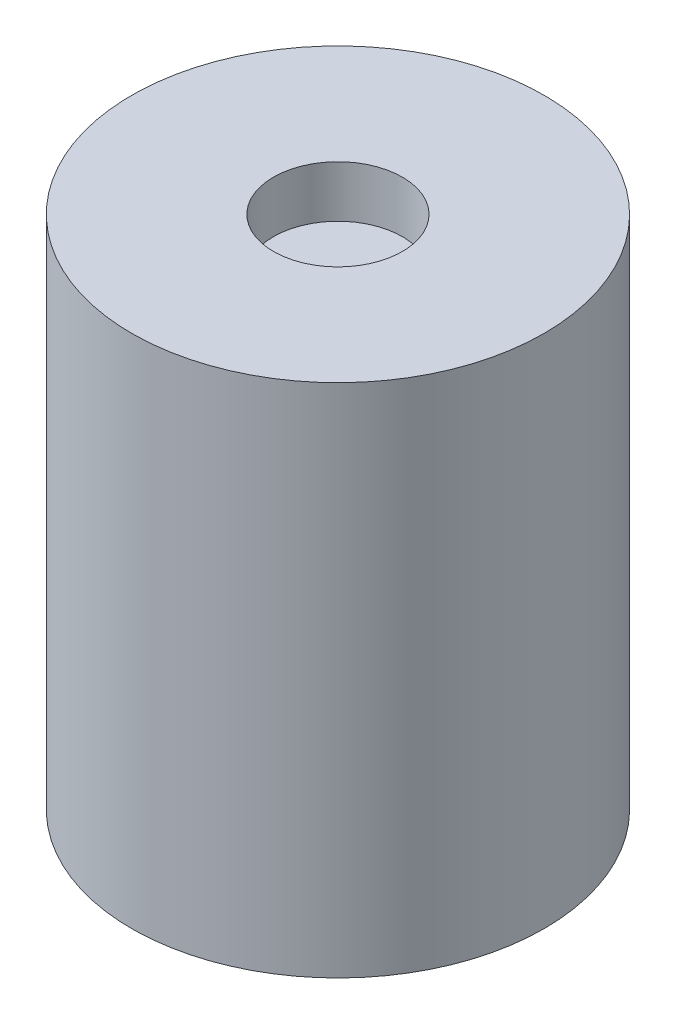
ISO-10303-21;
HEADER;
FILE_DESCRIPTION(('STEP AP214'),'2;1');
FILE_NAME('part.step','',(''),(''),'','','');
FILE_SCHEMA(('AUTOMOTIVE_DESIGN { 1 0 10303 214 1 1 1 1 }'));
ENDSEC;
DATA;
#1=APPLICATION_CONTEXT('core data for automotive mechanical design processes');
#2=APPLICATION_PROTOCOL_DEFINITION('international standard','automotive_design',2000,#1);
#3=PRODUCT_CONTEXT('',#1,'mechanical');
#4=PRODUCT('Part','Part','',(#3));
#5=PRODUCT_RELATED_PRODUCT_CATEGORY('part','',(#4));
#6=PRODUCT_DEFINITION_FORMATION('','',#4);
#7=PRODUCT_DEFINITION_CONTEXT('part definition',#1,'design');
#8=PRODUCT_DEFINITION('design','',#6,#7);
#9=PRODUCT_DEFINITION_SHAPE('','',#8);
#10=(LENGTH_UNIT() NAMED_UNIT(*) SI_UNIT(.MILLI.,.METRE.));
#11=(NAMED_UNIT(*) PLANE_ANGLE_UNIT() SI_UNIT($,.RADIAN.));
#12=(NAMED_UNIT(*) SI_UNIT($,.STERADIAN.) SOLID_ANGLE_UNIT());
#13=UNCERTAINTY_MEASURE_WITH_UNIT(LENGTH_MEASURE(1.E-05),#10,'distance_accuracy_value','');
#14=(GEOMETRIC_REPRESENTATION_CONTEXT(3) GLOBAL_UNCERTAINTY_ASSIGNED_CONTEXT((#13)) GLOBAL_UNIT_ASSIGNED_CONTEXT((#10,
#11,#12)) REPRESENTATION_CONTEXT('',''));
#15=CARTESIAN_POINT('',(0.,0.,0.));
#16=DIRECTION('',(0.,0.,1.));
#17=DIRECTION('',(1.,0.,0.));
#18=AXIS2_PLACEMENT_3D('',#15,#16,#17);
#19=CARTESIAN_POINT('',(0.,0.,0.));
#20=DIRECTION('',(0.,1.,0.));
#21=DIRECTION('',(1.,0.,0.));
#22=AXIS2_PLACEMENT_3D('',#19,#20,#21);
#23=PLANE('',#22);
#24=CARTESIAN_POINT('',(13.4187290871268,0.,8.71422456024041));
#25=DIRECTION('',(0.,1.,0.));
#26=DIRECTION('',(1.,0.,0.));
#27=AXIS2_PLACEMENT_3D('',#24,#25,#26);
#28=CIRCLE('',#27,2.);
#29=CARTESIAN_POINT('',(11.4187290871268,0.,8.71422456024041));
#30=VERTEX_POINT('',#29);
#31=EDGE_CURVE('E129',#30,#30,#28,.T.);
#32=ORIENTED_EDGE('',*,*,#31,.T.);
#33=EDGE_LOOP('',(#32));
#34=FACE_BOUND('',#33,.T.);
#35=CARTESIAN_POINT('',(-8.,0.,-13.856406460551));
#36=DIRECTION('',(0.,1.,0.));
#37=DIRECTION('',(1.,0.,0.));
#38=AXIS2_PLACEMENT_3D('',#35,#36,#37);
#39=CIRCLE('',#38,2.);
#40=CARTESIAN_POINT('',(-10.,0.,-13.856406460551));
#41=VERTEX_POINT('',#40);
#42=EDGE_CURVE('E144',#41,#41,#39,.T.);
#43=ORIENTED_EDGE('',*,*,#42,.T.);
#44=EDGE_LOOP('',(#43));
#45=FACE_BOUND('',#44,.T.);
#46=CARTESIAN_POINT('',(-16.,0.,0.));
#47=DIRECTION('',(0.,1.,0.));
#48=DIRECTION('',(1.,0.,0.));
#49=AXIS2_PLACEMENT_3D('',#46,#47,#48);
#50=CIRCLE('',#49,2.);
#51=CARTESIAN_POINT('',(-18.,0.,0.));
#52=VERTEX_POINT('',#51);
#53=EDGE_CURVE('E140',#52,#52,#50,.T.);
#54=ORIENTED_EDGE('',*,*,#53,.T.);
#55=EDGE_LOOP('',(#54));
#56=FACE_BOUND('',#55,.T.);
#57=CARTESIAN_POINT('',(16.,0.,0.));
#58=DIRECTION('',(0.,1.,0.));
#59=DIRECTION('',(1.,0.,0.));
#60=AXIS2_PLACEMENT_3D('',#57,#58,#59);
#61=CIRCLE('',#60,2.);
#62=CARTESIAN_POINT('',(14.,0.,0.));
#63=VERTEX_POINT('',#62);
#64=EDGE_CURVE('E21',#63,#63,#61,.T.);
#65=ORIENTED_EDGE('',*,*,#64,.T.);
#66=EDGE_LOOP('',(#65));
#67=FACE_BOUND('',#66,.T.);
#68=CARTESIAN_POINT('',(8.,0.,-13.856406460551));
#69=DIRECTION('',(0.,1.,0.));
#70=DIRECTION('',(1.,0.,0.));
#71=AXIS2_PLACEMENT_3D('',#68,#69,#70);
#72=CIRCLE('',#71,2.);
#73=CARTESIAN_POINT('',(6.,0.,-13.856406460551));
#74=VERTEX_POINT('',#73);
#75=EDGE_CURVE('E124',#74,#74,#72,.T.);
#76=ORIENTED_EDGE('',*,*,#75,.T.);
#77=EDGE_LOOP('',(#76));
#78=FACE_BOUND('',#77,.T.);
#79=CARTESIAN_POINT('',(-13.4187290871267,0.,8.71422456024041));
#80=DIRECTION('',(0.,1.,0.));
#81=DIRECTION('',(1.,0.,0.));
#82=AXIS2_PLACEMENT_3D('',#79,#80,#81);
#83=CIRCLE('',#82,2.);
#84=CARTESIAN_POINT('',(-15.4187290871267,0.,8.71422456024041));
#85=VERTEX_POINT('',#84);
#86=EDGE_CURVE('E165',#85,#85,#83,.T.);
#87=ORIENTED_EDGE('',*,*,#86,.T.);
#88=EDGE_LOOP('',(#87));
#89=FACE_BOUND('',#88,.T.);
#90=CARTESIAN_POINT('',(0.,0.,0.));
#91=DIRECTION('',(0.,1.,0.));
#92=DIRECTION('',(-1.,0.,0.));
#93=AXIS2_PLACEMENT_3D('',#90,#91,#92);
#94=CIRCLE('',#93,20.);
#95=CARTESIAN_POINT('',(20.,0.,0.));
#96=VERTEX_POINT('',#95);
#97=EDGE_CURVE('E11',#96,#96,#94,.T.);
#98=ORIENTED_EDGE('',*,*,#97,.F.);
#99=EDGE_LOOP('',(#98));
#100=FACE_BOUND('',#99,.T.);
#101=ADVANCED_FACE('F17',(#34,#45,#56,#67,#78,#89,#100),#23,.F.);
#102=CARTESIAN_POINT('',(0.,50.,0.));
#103=DIRECTION('',(0.,1.,0.));
#104=DIRECTION('',(1.,0.,0.));
#105=AXIS2_PLACEMENT_3D('',#102,#103,#104);
#106=PLANE('',#105);
#107=CARTESIAN_POINT('',(0.,50.,0.));
#108=DIRECTION('',(0.,-1.,0.));
#109=DIRECTION('',(1.,0.,0.));
#110=AXIS2_PLACEMENT_3D('',#107,#108,#109);
#111=CIRCLE('',#110,6.25);
#112=CARTESIAN_POINT('',(-6.25,50.,0.));
#113=VERTEX_POINT('',#112);
#114=EDGE_CURVE('E131',#113,#113,#111,.T.);
#115=ORIENTED_EDGE('',*,*,#114,.T.);
#116=EDGE_LOOP('',(#115));
#117=FACE_BOUND('',#116,.T.);
#118=CARTESIAN_POINT('',(0.,50.,0.));
#119=DIRECTION('',(0.,1.,0.));
#120=DIRECTION('',(-1.,0.,0.));
#121=AXIS2_PLACEMENT_3D('',#118,#119,#120);
#122=CIRCLE('',#121,20.);
#123=CARTESIAN_POINT('',(20.,50.,0.));
#124=VERTEX_POINT('',#123);
#125=EDGE_CURVE('E149',#124,#124,#122,.T.);
#126=ORIENTED_EDGE('',*,*,#125,.T.);
#127=EDGE_LOOP('',(#126));
#128=FACE_BOUND('',#127,.T.);
#129=ADVANCED_FACE('F197',(#117,#128),#106,.T.);
#130=CARTESIAN_POINT('',(0.,0.,0.));
#131=DIRECTION('',(0.,1.,0.));
#132=DIRECTION('',(-1.,0.,0.));
#133=AXIS2_PLACEMENT_3D('',#130,#131,#132);
#134=CYLINDRICAL_SURFACE('',#133,20.);
#135=ORIENTED_EDGE('',*,*,#125,.F.);
#136=DIRECTION('',(0.,-1.,0.));
#137=VECTOR('',#136,1.);
#138=CARTESIAN_POINT('',(20.,0.,0.));
#139=LINE('',#138,#137);
#140=EDGE_CURVE('E28',#124,#96,#139,.T.);
#141=ORIENTED_EDGE('',*,*,#140,.T.);
#142=ORIENTED_EDGE('',*,*,#97,.T.);
#143=ORIENTED_EDGE('',*,*,#140,.F.);
#144=EDGE_LOOP('',(#135,#141,#142,#143));
#145=FACE_BOUND('',#144,.T.);
#146=ADVANCED_FACE('F200',(#145),#134,.T.);
#147=CARTESIAN_POINT('',(13.4187290871268,6.,8.71422456024041));
#148=DIRECTION('',(0.,-1.,0.));
#149=DIRECTION('',(0.,0.,-1.));
#150=AXIS2_PLACEMENT_3D('',#147,#148,#149);
#151=PLANE('',#150);
#152=CARTESIAN_POINT('',(13.4187290871268,6.,8.71422456024041));
#153=DIRECTION('',(0.,1.,0.));
#154=DIRECTION('',(1.,0.,0.));
#155=AXIS2_PLACEMENT_3D('',#152,#153,#154);
#156=CIRCLE('',#155,2.);
#157=CARTESIAN_POINT('',(11.4187290871268,6.,8.71422456024041));
#158=VERTEX_POINT('',#157);
#159=EDGE_CURVE('E148',#158,#158,#156,.T.);
#160=ORIENTED_EDGE('',*,*,#159,.F.);
#161=EDGE_LOOP('',(#160));
#162=FACE_BOUND('',#161,.T.);
#163=ADVANCED_FACE('F204',(#162),#151,.T.);
#164=CARTESIAN_POINT('',(13.4187290871268,0.,8.71422456024041));
#165=DIRECTION('',(0.,1.,0.));
#166=DIRECTION('',(1.,0.,0.));
#167=AXIS2_PLACEMENT_3D('',#164,#165,#166);
#168=CYLINDRICAL_SURFACE('',#167,2.);
#169=ORIENTED_EDGE('',*,*,#31,.F.);
#170=DIRECTION('',(0.,1.,0.));
#171=VECTOR('',#170,1.);
#172=CARTESIAN_POINT('',(11.4187290871268,0.,8.71422456024041));
#173=LINE('',#172,#171);
#174=EDGE_CURVE('E90',#30,#158,#173,.T.);
#175=ORIENTED_EDGE('',*,*,#174,.T.);
#176=ORIENTED_EDGE('',*,*,#159,.T.);
#177=ORIENTED_EDGE('',*,*,#174,.F.);
#178=EDGE_LOOP('',(#169,#175,#176,#177));
#179=FACE_BOUND('',#178,.T.);
#180=ADVANCED_FACE('F211',(#179),#168,.F.);
#181=CARTESIAN_POINT('',(-8.,6.,-13.856406460551));
#182=DIRECTION('',(0.,-1.,0.));
#183=DIRECTION('',(0.,0.,-1.));
#184=AXIS2_PLACEMENT_3D('',#181,#182,#183);
#185=PLANE('',#184);
#186=CARTESIAN_POINT('',(-8.,6.,-13.856406460551));
#187=DIRECTION('',(0.,1.,0.));
#188=DIRECTION('',(1.,0.,0.));
#189=AXIS2_PLACEMENT_3D('',#186,#187,#188);
#190=CIRCLE('',#189,2.);
#191=CARTESIAN_POINT('',(-10.,6.,-13.856406460551));
#192=VERTEX_POINT('',#191);
#193=EDGE_CURVE('E82',#192,#192,#190,.T.);
#194=ORIENTED_EDGE('',*,*,#193,.F.);
#195=EDGE_LOOP('',(#194));
#196=FACE_BOUND('',#195,.T.);
#197=ADVANCED_FACE('F237',(#196),#185,.T.);
#198=CARTESIAN_POINT('',(-8.,0.,-13.856406460551));
#199=DIRECTION('',(0.,1.,0.));
#200=DIRECTION('',(1.,0.,0.));
#201=AXIS2_PLACEMENT_3D('',#198,#199,#200);
#202=CYLINDRICAL_SURFACE('',#201,2.);
#203=ORIENTED_EDGE('',*,*,#42,.F.);
#204=DIRECTION('',(0.,1.,0.));
#205=VECTOR('',#204,1.);
#206=CARTESIAN_POINT('',(-10.,0.,-13.856406460551));
#207=LINE('',#206,#205);
#208=EDGE_CURVE('E130',#41,#192,#207,.T.);
#209=ORIENTED_EDGE('',*,*,#208,.T.);
#210=ORIENTED_EDGE('',*,*,#193,.T.);
#211=ORIENTED_EDGE('',*,*,#208,.F.);
#212=EDGE_LOOP('',(#203,#209,#210,#211));
#213=FACE_BOUND('',#212,.T.);
#214=ADVANCED_FACE('F242',(#213),#202,.F.);
#215=CARTESIAN_POINT('',(-16.,6.,0.));
#216=DIRECTION('',(0.,-1.,0.));
#217=DIRECTION('',(0.,0.,-1.));
#218=AXIS2_PLACEMENT_3D('',#215,#216,#217);
#219=PLANE('',#218);
#220=CARTESIAN_POINT('',(-16.,6.,0.));
#221=DIRECTION('',(0.,1.,0.));
#222=DIRECTION('',(1.,0.,0.));
#223=AXIS2_PLACEMENT_3D('',#220,#221,#222);
#224=CIRCLE('',#223,2.);
#225=CARTESIAN_POINT('',(-18.,6.,0.));
#226=VERTEX_POINT('',#225);
#227=EDGE_CURVE('E141',#226,#226,#224,.T.);
#228=ORIENTED_EDGE('',*,*,#227,.F.);
#229=EDGE_LOOP('',(#228));
#230=FACE_BOUND('',#229,.T.);
#231=ADVANCED_FACE('F249',(#230),#219,.T.);
#232=CARTESIAN_POINT('',(-16.,0.,0.));
#233=DIRECTION('',(0.,1.,0.));
#234=DIRECTION('',(1.,0.,0.));
#235=AXIS2_PLACEMENT_3D('',#232,#233,#234);
#236=CYLINDRICAL_SURFACE('',#235,2.);
#237=ORIENTED_EDGE('',*,*,#53,.F.);
#238=DIRECTION('',(0.,1.,0.));
#239=VECTOR('',#238,1.);
#240=CARTESIAN_POINT('',(-18.,0.,0.));
#241=LINE('',#240,#239);
#242=EDGE_CURVE('E145',#52,#226,#241,.T.);
#243=ORIENTED_EDGE('',*,*,#242,.T.);
#244=ORIENTED_EDGE('',*,*,#227,.T.);
#245=ORIENTED_EDGE('',*,*,#242,.F.);
#246=EDGE_LOOP('',(#237,#243,#244,#245));
#247=FACE_BOUND('',#246,.T.);
#248=ADVANCED_FACE('F259',(#247),#236,.F.);
#249=CARTESIAN_POINT('',(16.,6.,0.));
#250=DIRECTION('',(0.,-1.,0.));
#251=DIRECTION('',(0.,0.,-1.));
#252=AXIS2_PLACEMENT_3D('',#249,#250,#251);
#253=PLANE('',#252);
#254=CARTESIAN_POINT('',(16.,6.,0.));
#255=DIRECTION('',(0.,1.,0.));
#256=DIRECTION('',(1.,0.,0.));
#257=AXIS2_PLACEMENT_3D('',#254,#255,#256);
#258=CIRCLE('',#257,2.);
#259=CARTESIAN_POINT('',(14.,6.,0.));
#260=VERTEX_POINT('',#259);
#261=EDGE_CURVE('E136',#260,#260,#258,.T.);
#262=ORIENTED_EDGE('',*,*,#261,.F.);
#263=EDGE_LOOP('',(#262));
#264=FACE_BOUND('',#263,.T.);
#265=ADVANCED_FACE('F223',(#264),#253,.T.);
#266=CARTESIAN_POINT('',(16.,0.,0.));
#267=DIRECTION('',(0.,1.,0.));
#268=DIRECTION('',(1.,0.,0.));
#269=AXIS2_PLACEMENT_3D('',#266,#267,#268);
#270=CYLINDRICAL_SURFACE('',#269,2.);
#271=ORIENTED_EDGE('',*,*,#64,.F.);
#272=DIRECTION('',(0.,1.,0.));
#273=VECTOR('',#272,1.);
#274=CARTESIAN_POINT('',(14.,0.,0.));
#275=LINE('',#274,#273);
#276=EDGE_CURVE('E123',#63,#260,#275,.T.);
#277=ORIENTED_EDGE('',*,*,#276,.T.);
#278=ORIENTED_EDGE('',*,*,#261,.T.);
#279=ORIENTED_EDGE('',*,*,#276,.F.);
#280=EDGE_LOOP('',(#271,#277,#278,#279));
#281=FACE_BOUND('',#280,.T.);
#282=ADVANCED_FACE('F229',(#281),#270,.F.);
#283=CARTESIAN_POINT('',(8.,6.,-13.856406460551));
#284=DIRECTION('',(0.,-1.,0.));
#285=DIRECTION('',(0.,0.,-1.));
#286=AXIS2_PLACEMENT_3D('',#283,#284,#285);
#287=PLANE('',#286);
#288=CARTESIAN_POINT('',(8.,6.,-13.856406460551));
#289=DIRECTION('',(0.,1.,0.));
#290=DIRECTION('',(1.,0.,0.));
#291=AXIS2_PLACEMENT_3D('',#288,#289,#290);
#292=CIRCLE('',#291,2.);
#293=CARTESIAN_POINT('',(6.,6.,-13.856406460551));
#294=VERTEX_POINT('',#293);
#295=EDGE_CURVE('E109',#294,#294,#292,.T.);
#296=ORIENTED_EDGE('',*,*,#295,.F.);
#297=EDGE_LOOP('',(#296));
#298=FACE_BOUND('',#297,.T.);
#299=ADVANCED_FACE('F228',(#298),#287,.T.);
#300=CARTESIAN_POINT('',(8.,0.,-13.856406460551));
#301=DIRECTION('',(0.,1.,0.));
#302=DIRECTION('',(1.,0.,0.));
#303=AXIS2_PLACEMENT_3D('',#300,#301,#302);
#304=CYLINDRICAL_SURFACE('',#303,2.);
#305=ORIENTED_EDGE('',*,*,#75,.F.);
#306=DIRECTION('',(0.,1.,0.));
#307=VECTOR('',#306,1.);
#308=CARTESIAN_POINT('',(6.,0.,-13.856406460551));
#309=LINE('',#308,#307);
#310=EDGE_CURVE('E112',#74,#294,#309,.T.);
#311=ORIENTED_EDGE('',*,*,#310,.T.);
#312=ORIENTED_EDGE('',*,*,#295,.T.);
#313=ORIENTED_EDGE('',*,*,#310,.F.);
#314=EDGE_LOOP('',(#305,#311,#312,#313));
#315=FACE_BOUND('',#314,.T.);
#316=ADVANCED_FACE('F111',(#315),#304,.F.);
#317=CARTESIAN_POINT('',(-13.4187290871267,6.,8.71422456024041));
#318=DIRECTION('',(0.,-1.,0.));
#319=DIRECTION('',(0.,0.,-1.));
#320=AXIS2_PLACEMENT_3D('',#317,#318,#319);
#321=PLANE('',#320);
#322=CARTESIAN_POINT('',(-13.4187290871267,6.,8.71422456024041));
#323=DIRECTION('',(0.,1.,0.));
#324=DIRECTION('',(1.,0.,0.));
#325=AXIS2_PLACEMENT_3D('',#322,#323,#324);
#326=CIRCLE('',#325,2.);
#327=CARTESIAN_POINT('',(-15.4187290871267,6.,8.71422456024041));
#328=VERTEX_POINT('',#327);
#329=EDGE_CURVE('E164',#328,#328,#326,.T.);
#330=ORIENTED_EDGE('',*,*,#329,.F.);
#331=EDGE_LOOP('',(#330));
#332=FACE_BOUND('',#331,.T.);
#333=ADVANCED_FACE('F227',(#332),#321,.T.);
#334=CARTESIAN_POINT('',(-13.4187290871267,0.,8.71422456024041));
#335=DIRECTION('',(0.,1.,0.));
#336=DIRECTION('',(1.,0.,0.));
#337=AXIS2_PLACEMENT_3D('',#334,#335,#336);
#338=CYLINDRICAL_SURFACE('',#337,2.);
#339=ORIENTED_EDGE('',*,*,#86,.F.);
#340=DIRECTION('',(0.,1.,0.));
#341=VECTOR('',#340,1.);
#342=CARTESIAN_POINT('',(-15.4187290871267,0.,8.71422456024041));
#343=LINE('',#342,#341);
#344=EDGE_CURVE('E160',#85,#328,#343,.T.);
#345=ORIENTED_EDGE('',*,*,#344,.T.);
#346=ORIENTED_EDGE('',*,*,#329,.T.);
#347=ORIENTED_EDGE('',*,*,#344,.F.);
#348=EDGE_LOOP('',(#339,#345,#346,#347));
#349=FACE_BOUND('',#348,.T.);
#350=ADVANCED_FACE('F234',(#349),#338,.F.);
#351=CARTESIAN_POINT('',(0.,45.,0.));
#352=DIRECTION('',(0.,1.,0.));
#353=DIRECTION('',(1.,0.,0.));
#354=AXIS2_PLACEMENT_3D('',#351,#352,#353);
#355=PLANE('',#354);
#356=CARTESIAN_POINT('',(0.,45.,0.));
#357=DIRECTION('',(0.,-1.,0.));
#358=DIRECTION('',(1.,0.,0.));
#359=AXIS2_PLACEMENT_3D('',#356,#357,#358);
#360=CIRCLE('',#359,6.25);
#361=CARTESIAN_POINT('',(-6.25,45.,0.));
#362=VERTEX_POINT('',#361);
#363=EDGE_CURVE('E169',#362,#362,#360,.T.);
#364=ORIENTED_EDGE('',*,*,#363,.F.);
#365=EDGE_LOOP('',(#364));
#366=FACE_BOUND('',#365,.T.);
#367=ADVANCED_FACE('F19',(#366),#355,.T.);
#368=CARTESIAN_POINT('',(0.,50.,0.));
#369=DIRECTION('',(0.,-1.,0.));
#370=DIRECTION('',(1.,0.,0.));
#371=AXIS2_PLACEMENT_3D('',#368,#369,#370);
#372=CYLINDRICAL_SURFACE('',#371,6.25);
#373=ORIENTED_EDGE('',*,*,#114,.F.);
#374=DIRECTION('',(0.,-1.,0.));
#375=VECTOR('',#374,1.);
#376=CARTESIAN_POINT('',(-6.25,50.,0.));
#377=LINE('',#376,#375);
#378=EDGE_CURVE('E135',#113,#362,#377,.T.);
#379=ORIENTED_EDGE('',*,*,#378,.T.);
#380=ORIENTED_EDGE('',*,*,#363,.T.);
#381=ORIENTED_EDGE('',*,*,#378,.F.);
#382=EDGE_LOOP('',(#373,#379,#380,#381));
#383=FACE_BOUND('',#382,.T.);
#384=ADVANCED_FACE('F194',(#383),#372,.F.);
#385=CLOSED_SHELL('',(#101,#129,#146,#163,#180,#197,#214,#231,#248,#265,#282,#299,#316,#333,
#350,#367,#384));
#386=MANIFOLD_SOLID_BREP('B1',#385);
#387=ADVANCED_BREP_SHAPE_REPRESENTATION('',(#18,#386),#14);
#388=SHAPE_DEFINITION_REPRESENTATION(#9,#387);
ENDSEC;
END-ISO-10303-21;
